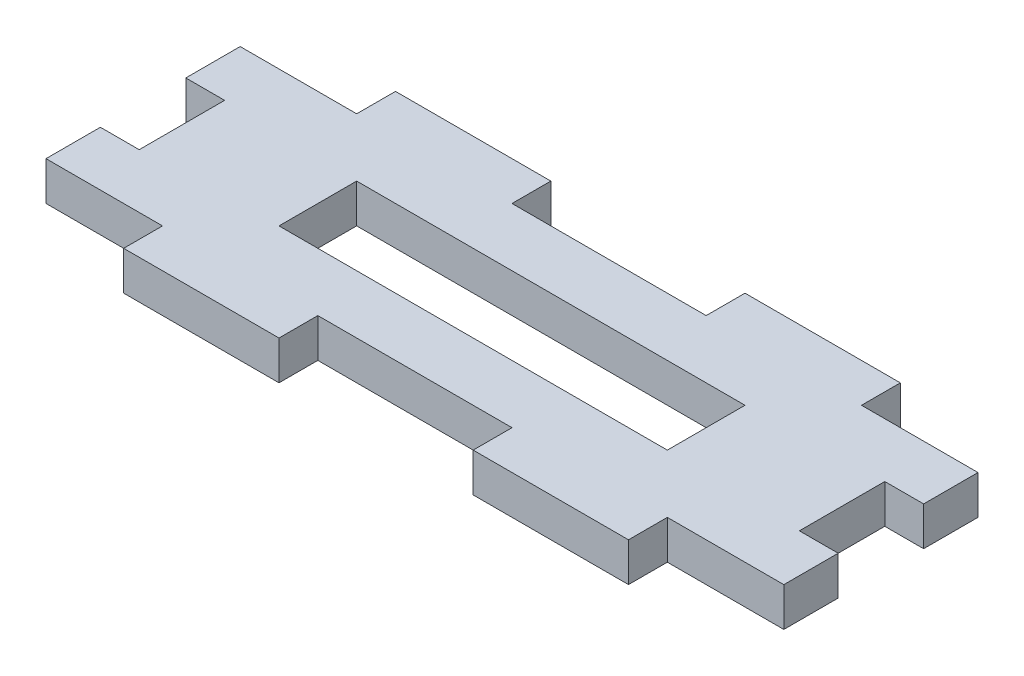
ISO-10303-21;
HEADER;
FILE_DESCRIPTION(('STEP AP214'),'2;1');
FILE_NAME('part.step','',(''),(''),'','','');
FILE_SCHEMA(('AUTOMOTIVE_DESIGN { 1 0 10303 214 1 1 1 1 }'));
ENDSEC;
DATA;
#1=APPLICATION_CONTEXT('core data for automotive mechanical design processes');
#2=APPLICATION_PROTOCOL_DEFINITION('international standard','automotive_design',2000,#1);
#3=PRODUCT_CONTEXT('',#1,'mechanical');
#4=PRODUCT('Part','Part','',(#3));
#5=PRODUCT_RELATED_PRODUCT_CATEGORY('part','',(#4));
#6=PRODUCT_DEFINITION_FORMATION('','',#4);
#7=PRODUCT_DEFINITION_CONTEXT('part definition',#1,'design');
#8=PRODUCT_DEFINITION('design','',#6,#7);
#9=PRODUCT_DEFINITION_SHAPE('','',#8);
#10=(LENGTH_UNIT() NAMED_UNIT(*) SI_UNIT(.MILLI.,.METRE.));
#11=(NAMED_UNIT(*) PLANE_ANGLE_UNIT() SI_UNIT($,.RADIAN.));
#12=(NAMED_UNIT(*) SI_UNIT($,.STERADIAN.) SOLID_ANGLE_UNIT());
#13=UNCERTAINTY_MEASURE_WITH_UNIT(LENGTH_MEASURE(1.E-05),#10,'distance_accuracy_value','');
#14=(GEOMETRIC_REPRESENTATION_CONTEXT(3) GLOBAL_UNCERTAINTY_ASSIGNED_CONTEXT((#13)) GLOBAL_UNIT_ASSIGNED_CONTEXT((#10,
#11,#12)) REPRESENTATION_CONTEXT('',''));
#15=CARTESIAN_POINT('',(0.,0.,0.));
#16=DIRECTION('',(0.,0.,1.));
#17=DIRECTION('',(1.,0.,0.));
#18=AXIS2_PLACEMENT_3D('',#15,#16,#17);
#19=CARTESIAN_POINT('',(0.,5.,0.));
#20=DIRECTION('',(0.,-1.,0.));
#21=DIRECTION('',(0.,0.,-1.));
#22=AXIS2_PLACEMENT_3D('',#19,#20,#21);
#23=PLANE('',#22);
#24=DIRECTION('',(0.,0.,-1.));
#25=VECTOR('',#24,1.);
#26=CARTESIAN_POINT('',(47.5,5.,-5.5));
#27=LINE('',#26,#25);
#28=CARTESIAN_POINT('',(47.5,5.,-5.5));
#29=VERTEX_POINT('',#28);
#30=CARTESIAN_POINT('',(47.5,5.,-12.5));
#31=VERTEX_POINT('',#30);
#32=EDGE_CURVE('E278',#29,#31,#27,.T.);
#33=ORIENTED_EDGE('',*,*,#32,.T.);
#34=DIRECTION('',(-1.,0.,0.));
#35=VECTOR('',#34,1.);
#36=CARTESIAN_POINT('',(32.5,5.,-12.5));
#37=LINE('',#36,#35);
#38=CARTESIAN_POINT('',(32.5,5.,-12.5));
#39=VERTEX_POINT('',#38);
#40=EDGE_CURVE('E281',#31,#39,#37,.T.);
#41=ORIENTED_EDGE('',*,*,#40,.T.);
#42=DIRECTION('',(0.,0.,-1.));
#43=VECTOR('',#42,1.);
#44=CARTESIAN_POINT('',(32.5,5.,-12.5));
#45=LINE('',#44,#43);
#46=CARTESIAN_POINT('',(32.5,5.,-17.5));
#47=VERTEX_POINT('',#46);
#48=EDGE_CURVE('E284',#39,#47,#45,.T.);
#49=ORIENTED_EDGE('',*,*,#48,.T.);
#50=DIRECTION('',(-1.,0.,0.));
#51=VECTOR('',#50,1.);
#52=CARTESIAN_POINT('',(12.5,5.,-17.5));
#53=LINE('',#52,#51);
#54=CARTESIAN_POINT('',(12.5,5.,-17.5));
#55=VERTEX_POINT('',#54);
#56=EDGE_CURVE('E286',#47,#55,#53,.T.);
#57=ORIENTED_EDGE('',*,*,#56,.T.);
#58=DIRECTION('',(0.,0.,1.));
#59=VECTOR('',#58,1.);
#60=CARTESIAN_POINT('',(12.5,5.,-12.5));
#61=LINE('',#60,#59);
#62=CARTESIAN_POINT('',(12.5,5.,-12.5));
#63=VERTEX_POINT('',#62);
#64=EDGE_CURVE('E288',#55,#63,#61,.T.);
#65=ORIENTED_EDGE('',*,*,#64,.T.);
#66=DIRECTION('',(-1.,0.,0.));
#67=VECTOR('',#66,1.);
#68=CARTESIAN_POINT('',(-12.5,5.,-12.5));
#69=LINE('',#68,#67);
#70=CARTESIAN_POINT('',(-12.5,5.,-12.5));
#71=VERTEX_POINT('',#70);
#72=EDGE_CURVE('E290',#63,#71,#69,.T.);
#73=ORIENTED_EDGE('',*,*,#72,.T.);
#74=DIRECTION('',(0.,0.,-1.));
#75=VECTOR('',#74,1.);
#76=CARTESIAN_POINT('',(-12.5,5.,-12.5));
#77=LINE('',#76,#75);
#78=CARTESIAN_POINT('',(-12.5,5.,-17.5));
#79=VERTEX_POINT('',#78);
#80=EDGE_CURVE('E292',#71,#79,#77,.T.);
#81=ORIENTED_EDGE('',*,*,#80,.T.);
#82=DIRECTION('',(-1.,0.,0.));
#83=VECTOR('',#82,1.);
#84=CARTESIAN_POINT('',(-32.5,5.,-17.5));
#85=LINE('',#84,#83);
#86=CARTESIAN_POINT('',(-32.5,5.,-17.5));
#87=VERTEX_POINT('',#86);
#88=EDGE_CURVE('E294',#79,#87,#85,.T.);
#89=ORIENTED_EDGE('',*,*,#88,.T.);
#90=DIRECTION('',(0.,0.,1.));
#91=VECTOR('',#90,1.);
#92=CARTESIAN_POINT('',(-32.5,5.,-12.5));
#93=LINE('',#92,#91);
#94=CARTESIAN_POINT('',(-32.5,5.,-12.5));
#95=VERTEX_POINT('',#94);
#96=EDGE_CURVE('E296',#87,#95,#93,.T.);
#97=ORIENTED_EDGE('',*,*,#96,.T.);
#98=DIRECTION('',(-1.,0.,0.));
#99=VECTOR('',#98,1.);
#100=CARTESIAN_POINT('',(-47.5,5.,-12.5));
#101=LINE('',#100,#99);
#102=CARTESIAN_POINT('',(-47.5,5.,-12.5));
#103=VERTEX_POINT('',#102);
#104=EDGE_CURVE('E298',#95,#103,#101,.T.);
#105=ORIENTED_EDGE('',*,*,#104,.T.);
#106=DIRECTION('',(0.,0.,1.));
#107=VECTOR('',#106,1.);
#108=CARTESIAN_POINT('',(-47.5,5.,-5.5));
#109=LINE('',#108,#107);
#110=CARTESIAN_POINT('',(-47.5,5.,-5.5));
#111=VERTEX_POINT('',#110);
#112=EDGE_CURVE('E300',#103,#111,#109,.T.);
#113=ORIENTED_EDGE('',*,*,#112,.T.);
#114=DIRECTION('',(1.,0.,0.));
#115=VECTOR('',#114,1.);
#116=CARTESIAN_POINT('',(-47.5,5.,-5.5));
#117=LINE('',#116,#115);
#118=CARTESIAN_POINT('',(-42.5,5.,-5.5));
#119=VERTEX_POINT('',#118);
#120=EDGE_CURVE('E302',#111,#119,#117,.T.);
#121=ORIENTED_EDGE('',*,*,#120,.T.);
#122=DIRECTION('',(0.,0.,1.));
#123=VECTOR('',#122,1.);
#124=CARTESIAN_POINT('',(-42.5,5.,-5.5));
#125=LINE('',#124,#123);
#126=CARTESIAN_POINT('',(-42.5,5.,5.50000000000001));
#127=VERTEX_POINT('',#126);
#128=EDGE_CURVE('E304',#119,#127,#125,.T.);
#129=ORIENTED_EDGE('',*,*,#128,.T.);
#130=DIRECTION('',(-1.,0.,0.));
#131=VECTOR('',#130,1.);
#132=CARTESIAN_POINT('',(-47.5,5.,5.5));
#133=LINE('',#132,#131);
#134=CARTESIAN_POINT('',(-47.5,5.,5.5));
#135=VERTEX_POINT('',#134);
#136=EDGE_CURVE('E306',#127,#135,#133,.T.);
#137=ORIENTED_EDGE('',*,*,#136,.T.);
#138=DIRECTION('',(0.,0.,1.));
#139=VECTOR('',#138,1.);
#140=CARTESIAN_POINT('',(-47.5,5.,12.5));
#141=LINE('',#140,#139);
#142=CARTESIAN_POINT('',(-47.5,5.,12.5));
#143=VERTEX_POINT('',#142);
#144=EDGE_CURVE('E308',#135,#143,#141,.T.);
#145=ORIENTED_EDGE('',*,*,#144,.T.);
#146=DIRECTION('',(1.,0.,0.));
#147=VECTOR('',#146,1.);
#148=CARTESIAN_POINT('',(-47.5,5.,12.5));
#149=LINE('',#148,#147);
#150=CARTESIAN_POINT('',(-32.5,5.,12.5));
#151=VERTEX_POINT('',#150);
#152=EDGE_CURVE('E310',#143,#151,#149,.T.);
#153=ORIENTED_EDGE('',*,*,#152,.T.);
#154=DIRECTION('',(0.,0.,1.));
#155=VECTOR('',#154,1.);
#156=CARTESIAN_POINT('',(-32.5,5.,12.5));
#157=LINE('',#156,#155);
#158=CARTESIAN_POINT('',(-32.5,5.,17.5));
#159=VERTEX_POINT('',#158);
#160=EDGE_CURVE('E312',#151,#159,#157,.T.);
#161=ORIENTED_EDGE('',*,*,#160,.T.);
#162=DIRECTION('',(1.,0.,0.));
#163=VECTOR('',#162,1.);
#164=CARTESIAN_POINT('',(-32.5,5.,17.5));
#165=LINE('',#164,#163);
#166=CARTESIAN_POINT('',(-12.5,5.,17.5));
#167=VERTEX_POINT('',#166);
#168=EDGE_CURVE('E314',#159,#167,#165,.T.);
#169=ORIENTED_EDGE('',*,*,#168,.T.);
#170=DIRECTION('',(0.,0.,-1.));
#171=VECTOR('',#170,1.);
#172=CARTESIAN_POINT('',(-12.5,5.,12.5));
#173=LINE('',#172,#171);
#174=CARTESIAN_POINT('',(-12.5,5.,12.5));
#175=VERTEX_POINT('',#174);
#176=EDGE_CURVE('E316',#167,#175,#173,.T.);
#177=ORIENTED_EDGE('',*,*,#176,.T.);
#178=DIRECTION('',(1.,0.,0.));
#179=VECTOR('',#178,1.);
#180=CARTESIAN_POINT('',(-12.5,5.,12.5));
#181=LINE('',#180,#179);
#182=CARTESIAN_POINT('',(12.5,5.,12.5));
#183=VERTEX_POINT('',#182);
#184=EDGE_CURVE('E318',#175,#183,#181,.T.);
#185=ORIENTED_EDGE('',*,*,#184,.T.);
#186=DIRECTION('',(0.,0.,1.));
#187=VECTOR('',#186,1.);
#188=CARTESIAN_POINT('',(12.5,5.,12.5));
#189=LINE('',#188,#187);
#190=CARTESIAN_POINT('',(12.5,5.,17.5));
#191=VERTEX_POINT('',#190);
#192=EDGE_CURVE('E320',#183,#191,#189,.T.);
#193=ORIENTED_EDGE('',*,*,#192,.T.);
#194=DIRECTION('',(1.,0.,0.));
#195=VECTOR('',#194,1.);
#196=CARTESIAN_POINT('',(12.5,5.,17.5));
#197=LINE('',#196,#195);
#198=CARTESIAN_POINT('',(32.5,5.,17.5));
#199=VERTEX_POINT('',#198);
#200=EDGE_CURVE('E322',#191,#199,#197,.T.);
#201=ORIENTED_EDGE('',*,*,#200,.T.);
#202=DIRECTION('',(0.,0.,-1.));
#203=VECTOR('',#202,1.);
#204=CARTESIAN_POINT('',(32.5,5.,12.5));
#205=LINE('',#204,#203);
#206=CARTESIAN_POINT('',(32.5,5.,12.5));
#207=VERTEX_POINT('',#206);
#208=EDGE_CURVE('E324',#199,#207,#205,.T.);
#209=ORIENTED_EDGE('',*,*,#208,.T.);
#210=DIRECTION('',(1.,0.,0.));
#211=VECTOR('',#210,1.);
#212=CARTESIAN_POINT('',(32.5,5.,12.5));
#213=LINE('',#212,#211);
#214=CARTESIAN_POINT('',(47.5,5.,12.5));
#215=VERTEX_POINT('',#214);
#216=EDGE_CURVE('E326',#207,#215,#213,.T.);
#217=ORIENTED_EDGE('',*,*,#216,.T.);
#218=DIRECTION('',(0.,0.,-1.));
#219=VECTOR('',#218,1.);
#220=CARTESIAN_POINT('',(47.5,5.,12.5));
#221=LINE('',#220,#219);
#222=CARTESIAN_POINT('',(47.5,5.,5.5));
#223=VERTEX_POINT('',#222);
#224=EDGE_CURVE('E328',#215,#223,#221,.T.);
#225=ORIENTED_EDGE('',*,*,#224,.T.);
#226=DIRECTION('',(-1.,0.,0.));
#227=VECTOR('',#226,1.);
#228=CARTESIAN_POINT('',(47.5,5.,5.5));
#229=LINE('',#228,#227);
#230=CARTESIAN_POINT('',(42.5,5.,5.50000000000001));
#231=VERTEX_POINT('',#230);
#232=EDGE_CURVE('E330',#223,#231,#229,.T.);
#233=ORIENTED_EDGE('',*,*,#232,.T.);
#234=DIRECTION('',(0.,0.,-1.));
#235=VECTOR('',#234,1.);
#236=CARTESIAN_POINT('',(42.5,5.,-5.5));
#237=LINE('',#236,#235);
#238=CARTESIAN_POINT('',(42.5,5.,-5.5));
#239=VERTEX_POINT('',#238);
#240=EDGE_CURVE('E332',#231,#239,#237,.T.);
#241=ORIENTED_EDGE('',*,*,#240,.T.);
#242=DIRECTION('',(1.,0.,0.));
#243=VECTOR('',#242,1.);
#244=CARTESIAN_POINT('',(47.5,5.,-5.5));
#245=LINE('',#244,#243);
#246=EDGE_CURVE('E334',#239,#29,#245,.T.);
#247=ORIENTED_EDGE('',*,*,#246,.T.);
#248=EDGE_LOOP('',(#33,#41,#49,#57,#65,#73,#81,#89,#97,#105,#113,#121,#129,#137,#145,#153,#161,
#169,#177,#185,#193,#201,#209,#217,#225,#233,#241,#247));
#249=FACE_BOUND('',#248,.T.);
#250=DIRECTION('',(0.,0.,-1.));
#251=VECTOR('',#250,1.);
#252=CARTESIAN_POINT('',(25.,5.,5.));
#253=LINE('',#252,#251);
#254=CARTESIAN_POINT('',(25.,5.,5.));
#255=VERTEX_POINT('',#254);
#256=CARTESIAN_POINT('',(25.,5.,-5.));
#257=VERTEX_POINT('',#256);
#258=EDGE_CURVE('E242',#255,#257,#253,.T.);
#259=ORIENTED_EDGE('',*,*,#258,.F.);
#260=DIRECTION('',(1.,0.,0.));
#261=VECTOR('',#260,1.);
#262=CARTESIAN_POINT('',(-25.,5.,5.));
#263=LINE('',#262,#261);
#264=CARTESIAN_POINT('',(-25.,5.,5.));
#265=VERTEX_POINT('',#264);
#266=EDGE_CURVE('E264',#265,#255,#263,.T.);
#267=ORIENTED_EDGE('',*,*,#266,.F.);
#268=DIRECTION('',(0.,0.,1.));
#269=VECTOR('',#268,1.);
#270=CARTESIAN_POINT('',(-25.,5.,5.));
#271=LINE('',#270,#269);
#272=CARTESIAN_POINT('',(-25.,5.,-5.));
#273=VERTEX_POINT('',#272);
#274=EDGE_CURVE('E262',#273,#265,#271,.T.);
#275=ORIENTED_EDGE('',*,*,#274,.F.);
#276=DIRECTION('',(-1.,0.,0.));
#277=VECTOR('',#276,1.);
#278=CARTESIAN_POINT('',(-25.,5.,-5.));
#279=LINE('',#278,#277);
#280=EDGE_CURVE('E250',#257,#273,#279,.T.);
#281=ORIENTED_EDGE('',*,*,#280,.F.);
#282=EDGE_LOOP('',(#259,#267,#275,#281));
#283=FACE_BOUND('',#282,.T.);
#284=ADVANCED_FACE('F33',(#249,#283),#23,.F.);
#285=CARTESIAN_POINT('',(0.,0.,0.));
#286=DIRECTION('',(0.,-1.,0.));
#287=DIRECTION('',(0.,0.,-1.));
#288=AXIS2_PLACEMENT_3D('',#285,#286,#287);
#289=PLANE('',#288);
#290=DIRECTION('',(0.,0.,-1.));
#291=VECTOR('',#290,1.);
#292=CARTESIAN_POINT('',(47.5,0.,-5.5));
#293=LINE('',#292,#291);
#294=CARTESIAN_POINT('',(47.5,0.,-5.5));
#295=VERTEX_POINT('',#294);
#296=CARTESIAN_POINT('',(47.5,0.,-12.5));
#297=VERTEX_POINT('',#296);
#298=EDGE_CURVE('E258',#295,#297,#293,.T.);
#299=ORIENTED_EDGE('',*,*,#298,.F.);
#300=DIRECTION('',(1.,0.,0.));
#301=VECTOR('',#300,1.);
#302=CARTESIAN_POINT('',(47.5,0.,-5.5));
#303=LINE('',#302,#301);
#304=CARTESIAN_POINT('',(42.5,0.,-5.5));
#305=VERTEX_POINT('',#304);
#306=EDGE_CURVE('E282',#305,#295,#303,.T.);
#307=ORIENTED_EDGE('',*,*,#306,.F.);
#308=DIRECTION('',(0.,0.,-1.));
#309=VECTOR('',#308,1.);
#310=CARTESIAN_POINT('',(42.5,0.,-5.5));
#311=LINE('',#310,#309);
#312=CARTESIAN_POINT('',(42.5,0.,5.50000000000001));
#313=VERTEX_POINT('',#312);
#314=EDGE_CURVE('E389',#313,#305,#311,.T.);
#315=ORIENTED_EDGE('',*,*,#314,.F.);
#316=DIRECTION('',(-1.,0.,0.));
#317=VECTOR('',#316,1.);
#318=CARTESIAN_POINT('',(47.5,0.,5.5));
#319=LINE('',#318,#317);
#320=CARTESIAN_POINT('',(47.5,0.,5.5));
#321=VERTEX_POINT('',#320);
#322=EDGE_CURVE('E387',#321,#313,#319,.T.);
#323=ORIENTED_EDGE('',*,*,#322,.F.);
#324=DIRECTION('',(0.,0.,-1.));
#325=VECTOR('',#324,1.);
#326=CARTESIAN_POINT('',(47.5,0.,12.5));
#327=LINE('',#326,#325);
#328=CARTESIAN_POINT('',(47.5,0.,12.5));
#329=VERTEX_POINT('',#328);
#330=EDGE_CURVE('E385',#329,#321,#327,.T.);
#331=ORIENTED_EDGE('',*,*,#330,.F.);
#332=DIRECTION('',(1.,0.,0.));
#333=VECTOR('',#332,1.);
#334=CARTESIAN_POINT('',(32.5,0.,12.5));
#335=LINE('',#334,#333);
#336=CARTESIAN_POINT('',(32.5,0.,12.5));
#337=VERTEX_POINT('',#336);
#338=EDGE_CURVE('E383',#337,#329,#335,.T.);
#339=ORIENTED_EDGE('',*,*,#338,.F.);
#340=DIRECTION('',(0.,0.,-1.));
#341=VECTOR('',#340,1.);
#342=CARTESIAN_POINT('',(32.5,0.,12.5));
#343=LINE('',#342,#341);
#344=CARTESIAN_POINT('',(32.5,0.,17.5));
#345=VERTEX_POINT('',#344);
#346=EDGE_CURVE('E381',#345,#337,#343,.T.);
#347=ORIENTED_EDGE('',*,*,#346,.F.);
#348=DIRECTION('',(1.,0.,0.));
#349=VECTOR('',#348,1.);
#350=CARTESIAN_POINT('',(12.5,0.,17.5));
#351=LINE('',#350,#349);
#352=CARTESIAN_POINT('',(12.5,0.,17.5));
#353=VERTEX_POINT('',#352);
#354=EDGE_CURVE('E379',#353,#345,#351,.T.);
#355=ORIENTED_EDGE('',*,*,#354,.F.);
#356=DIRECTION('',(0.,0.,1.));
#357=VECTOR('',#356,1.);
#358=CARTESIAN_POINT('',(12.5,0.,12.5));
#359=LINE('',#358,#357);
#360=CARTESIAN_POINT('',(12.5,0.,12.5));
#361=VERTEX_POINT('',#360);
#362=EDGE_CURVE('E377',#361,#353,#359,.T.);
#363=ORIENTED_EDGE('',*,*,#362,.F.);
#364=DIRECTION('',(1.,0.,0.));
#365=VECTOR('',#364,1.);
#366=CARTESIAN_POINT('',(-12.5,0.,12.5));
#367=LINE('',#366,#365);
#368=CARTESIAN_POINT('',(-12.5,0.,12.5));
#369=VERTEX_POINT('',#368);
#370=EDGE_CURVE('E375',#369,#361,#367,.T.);
#371=ORIENTED_EDGE('',*,*,#370,.F.);
#372=DIRECTION('',(0.,0.,-1.));
#373=VECTOR('',#372,1.);
#374=CARTESIAN_POINT('',(-12.5,0.,12.5));
#375=LINE('',#374,#373);
#376=CARTESIAN_POINT('',(-12.5,0.,17.5));
#377=VERTEX_POINT('',#376);
#378=EDGE_CURVE('E373',#377,#369,#375,.T.);
#379=ORIENTED_EDGE('',*,*,#378,.F.);
#380=DIRECTION('',(1.,0.,0.));
#381=VECTOR('',#380,1.);
#382=CARTESIAN_POINT('',(-32.5,0.,17.5));
#383=LINE('',#382,#381);
#384=CARTESIAN_POINT('',(-32.5,0.,17.5));
#385=VERTEX_POINT('',#384);
#386=EDGE_CURVE('E371',#385,#377,#383,.T.);
#387=ORIENTED_EDGE('',*,*,#386,.F.);
#388=DIRECTION('',(0.,0.,1.));
#389=VECTOR('',#388,1.);
#390=CARTESIAN_POINT('',(-32.5,0.,12.5));
#391=LINE('',#390,#389);
#392=CARTESIAN_POINT('',(-32.5,0.,12.5));
#393=VERTEX_POINT('',#392);
#394=EDGE_CURVE('E369',#393,#385,#391,.T.);
#395=ORIENTED_EDGE('',*,*,#394,.F.);
#396=DIRECTION('',(1.,0.,0.));
#397=VECTOR('',#396,1.);
#398=CARTESIAN_POINT('',(-47.5,0.,12.5));
#399=LINE('',#398,#397);
#400=CARTESIAN_POINT('',(-47.5,0.,12.5));
#401=VERTEX_POINT('',#400);
#402=EDGE_CURVE('E367',#401,#393,#399,.T.);
#403=ORIENTED_EDGE('',*,*,#402,.F.);
#404=DIRECTION('',(0.,0.,1.));
#405=VECTOR('',#404,1.);
#406=CARTESIAN_POINT('',(-47.5,0.,12.5));
#407=LINE('',#406,#405);
#408=CARTESIAN_POINT('',(-47.5,0.,5.5));
#409=VERTEX_POINT('',#408);
#410=EDGE_CURVE('E365',#409,#401,#407,.T.);
#411=ORIENTED_EDGE('',*,*,#410,.F.);
#412=DIRECTION('',(-1.,0.,0.));
#413=VECTOR('',#412,1.);
#414=CARTESIAN_POINT('',(-47.5,0.,5.5));
#415=LINE('',#414,#413);
#416=CARTESIAN_POINT('',(-42.5,0.,5.50000000000001));
#417=VERTEX_POINT('',#416);
#418=EDGE_CURVE('E363',#417,#409,#415,.T.);
#419=ORIENTED_EDGE('',*,*,#418,.F.);
#420=DIRECTION('',(0.,0.,1.));
#421=VECTOR('',#420,1.);
#422=CARTESIAN_POINT('',(-42.5,0.,-5.5));
#423=LINE('',#422,#421);
#424=CARTESIAN_POINT('',(-42.5,0.,-5.5));
#425=VERTEX_POINT('',#424);
#426=EDGE_CURVE('E361',#425,#417,#423,.T.);
#427=ORIENTED_EDGE('',*,*,#426,.F.);
#428=DIRECTION('',(1.,0.,0.));
#429=VECTOR('',#428,1.);
#430=CARTESIAN_POINT('',(-47.5,0.,-5.5));
#431=LINE('',#430,#429);
#432=CARTESIAN_POINT('',(-47.5,0.,-5.5));
#433=VERTEX_POINT('',#432);
#434=EDGE_CURVE('E359',#433,#425,#431,.T.);
#435=ORIENTED_EDGE('',*,*,#434,.F.);
#436=DIRECTION('',(0.,0.,1.));
#437=VECTOR('',#436,1.);
#438=CARTESIAN_POINT('',(-47.5,0.,-5.5));
#439=LINE('',#438,#437);
#440=CARTESIAN_POINT('',(-47.5,0.,-12.5));
#441=VERTEX_POINT('',#440);
#442=EDGE_CURVE('E357',#441,#433,#439,.T.);
#443=ORIENTED_EDGE('',*,*,#442,.F.);
#444=DIRECTION('',(-1.,0.,0.));
#445=VECTOR('',#444,1.);
#446=CARTESIAN_POINT('',(-47.5,0.,-12.5));
#447=LINE('',#446,#445);
#448=CARTESIAN_POINT('',(-32.5,0.,-12.5));
#449=VERTEX_POINT('',#448);
#450=EDGE_CURVE('E355',#449,#441,#447,.T.);
#451=ORIENTED_EDGE('',*,*,#450,.F.);
#452=DIRECTION('',(0.,0.,1.));
#453=VECTOR('',#452,1.);
#454=CARTESIAN_POINT('',(-32.5,0.,-12.5));
#455=LINE('',#454,#453);
#456=CARTESIAN_POINT('',(-32.5,0.,-17.5));
#457=VERTEX_POINT('',#456);
#458=EDGE_CURVE('E353',#457,#449,#455,.T.);
#459=ORIENTED_EDGE('',*,*,#458,.F.);
#460=DIRECTION('',(-1.,0.,0.));
#461=VECTOR('',#460,1.);
#462=CARTESIAN_POINT('',(-32.5,0.,-17.5));
#463=LINE('',#462,#461);
#464=CARTESIAN_POINT('',(-12.5,0.,-17.5));
#465=VERTEX_POINT('',#464);
#466=EDGE_CURVE('E351',#465,#457,#463,.T.);
#467=ORIENTED_EDGE('',*,*,#466,.F.);
#468=DIRECTION('',(0.,0.,-1.));
#469=VECTOR('',#468,1.);
#470=CARTESIAN_POINT('',(-12.5,0.,-12.5));
#471=LINE('',#470,#469);
#472=CARTESIAN_POINT('',(-12.5,0.,-12.5));
#473=VERTEX_POINT('',#472);
#474=EDGE_CURVE('E349',#473,#465,#471,.T.);
#475=ORIENTED_EDGE('',*,*,#474,.F.);
#476=DIRECTION('',(-1.,0.,0.));
#477=VECTOR('',#476,1.);
#478=CARTESIAN_POINT('',(-12.5,0.,-12.5));
#479=LINE('',#478,#477);
#480=CARTESIAN_POINT('',(12.5,0.,-12.5));
#481=VERTEX_POINT('',#480);
#482=EDGE_CURVE('E347',#481,#473,#479,.T.);
#483=ORIENTED_EDGE('',*,*,#482,.F.);
#484=DIRECTION('',(0.,0.,1.));
#485=VECTOR('',#484,1.);
#486=CARTESIAN_POINT('',(12.5,0.,-12.5));
#487=LINE('',#486,#485);
#488=CARTESIAN_POINT('',(12.5,0.,-17.5));
#489=VERTEX_POINT('',#488);
#490=EDGE_CURVE('E345',#489,#481,#487,.T.);
#491=ORIENTED_EDGE('',*,*,#490,.F.);
#492=DIRECTION('',(-1.,0.,0.));
#493=VECTOR('',#492,1.);
#494=CARTESIAN_POINT('',(12.5,0.,-17.5));
#495=LINE('',#494,#493);
#496=CARTESIAN_POINT('',(32.5,0.,-17.5));
#497=VERTEX_POINT('',#496);
#498=EDGE_CURVE('E343',#497,#489,#495,.T.);
#499=ORIENTED_EDGE('',*,*,#498,.F.);
#500=DIRECTION('',(0.,0.,-1.));
#501=VECTOR('',#500,1.);
#502=CARTESIAN_POINT('',(32.5,0.,-12.5));
#503=LINE('',#502,#501);
#504=CARTESIAN_POINT('',(32.5,0.,-12.5));
#505=VERTEX_POINT('',#504);
#506=EDGE_CURVE('E341',#505,#497,#503,.T.);
#507=ORIENTED_EDGE('',*,*,#506,.F.);
#508=DIRECTION('',(-1.,0.,0.));
#509=VECTOR('',#508,1.);
#510=CARTESIAN_POINT('',(32.5,0.,-12.5));
#511=LINE('',#510,#509);
#512=EDGE_CURVE('E339',#297,#505,#511,.T.);
#513=ORIENTED_EDGE('',*,*,#512,.F.);
#514=EDGE_LOOP('',(#299,#307,#315,#323,#331,#339,#347,#355,#363,#371,#379,#387,#395,#403,#411,
#419,#427,#435,#443,#451,#459,#467,#475,#483,#491,#499,#507,#513));
#515=FACE_BOUND('',#514,.T.);
#516=DIRECTION('',(1.,0.,0.));
#517=VECTOR('',#516,1.);
#518=CARTESIAN_POINT('',(-25.,0.,5.));
#519=LINE('',#518,#517);
#520=CARTESIAN_POINT('',(-25.,0.,5.));
#521=VERTEX_POINT('',#520);
#522=CARTESIAN_POINT('',(25.,0.,5.));
#523=VERTEX_POINT('',#522);
#524=EDGE_CURVE('E251',#521,#523,#519,.T.);
#525=ORIENTED_EDGE('',*,*,#524,.T.);
#526=DIRECTION('',(0.,0.,-1.));
#527=VECTOR('',#526,1.);
#528=CARTESIAN_POINT('',(25.,0.,5.));
#529=LINE('',#528,#527);
#530=CARTESIAN_POINT('',(25.,0.,-5.));
#531=VERTEX_POINT('',#530);
#532=EDGE_CURVE('E56',#523,#531,#529,.T.);
#533=ORIENTED_EDGE('',*,*,#532,.T.);
#534=DIRECTION('',(-1.,0.,0.));
#535=VECTOR('',#534,1.);
#536=CARTESIAN_POINT('',(-25.,0.,-5.));
#537=LINE('',#536,#535);
#538=CARTESIAN_POINT('',(-25.,0.,-5.));
#539=VERTEX_POINT('',#538);
#540=EDGE_CURVE('E257',#531,#539,#537,.T.);
#541=ORIENTED_EDGE('',*,*,#540,.T.);
#542=DIRECTION('',(0.,0.,1.));
#543=VECTOR('',#542,1.);
#544=CARTESIAN_POINT('',(-25.,0.,5.));
#545=LINE('',#544,#543);
#546=EDGE_CURVE('E270',#539,#521,#545,.T.);
#547=ORIENTED_EDGE('',*,*,#546,.T.);
#548=EDGE_LOOP('',(#525,#533,#541,#547));
#549=FACE_BOUND('',#548,.T.);
#550=ADVANCED_FACE('F479',(#515,#549),#289,.T.);
#551=CARTESIAN_POINT('',(47.5,5.,-5.5));
#552=DIRECTION('',(-1.,0.,0.));
#553=DIRECTION('',(0.,0.,1.));
#554=AXIS2_PLACEMENT_3D('',#551,#552,#553);
#555=PLANE('',#554);
#556=ORIENTED_EDGE('',*,*,#298,.T.);
#557=DIRECTION('',(0.,-1.,0.));
#558=VECTOR('',#557,1.);
#559=CARTESIAN_POINT('',(47.5,5.,-12.5));
#560=LINE('',#559,#558);
#561=EDGE_CURVE('E11',#31,#297,#560,.T.);
#562=ORIENTED_EDGE('',*,*,#561,.F.);
#563=ORIENTED_EDGE('',*,*,#32,.F.);
#564=DIRECTION('',(0.,-1.,0.));
#565=VECTOR('',#564,1.);
#566=CARTESIAN_POINT('',(47.5,5.,-5.5));
#567=LINE('',#566,#565);
#568=EDGE_CURVE('E336',#29,#295,#567,.T.);
#569=ORIENTED_EDGE('',*,*,#568,.T.);
#570=EDGE_LOOP('',(#556,#562,#563,#569));
#571=FACE_BOUND('',#570,.T.);
#572=ADVANCED_FACE('F35',(#571),#555,.F.);
#573=CARTESIAN_POINT('',(32.5,5.,-12.5));
#574=DIRECTION('',(0.,0.,1.));
#575=DIRECTION('',(1.,0.,0.));
#576=AXIS2_PLACEMENT_3D('',#573,#574,#575);
#577=PLANE('',#576);
#578=ORIENTED_EDGE('',*,*,#512,.T.);
#579=DIRECTION('',(0.,-1.,0.));
#580=VECTOR('',#579,1.);
#581=CARTESIAN_POINT('',(32.5,5.,-12.5));
#582=LINE('',#581,#580);
#583=EDGE_CURVE('E41',#39,#505,#582,.T.);
#584=ORIENTED_EDGE('',*,*,#583,.F.);
#585=ORIENTED_EDGE('',*,*,#40,.F.);
#586=ORIENTED_EDGE('',*,*,#561,.T.);
#587=EDGE_LOOP('',(#578,#584,#585,#586));
#588=FACE_BOUND('',#587,.T.);
#589=ADVANCED_FACE('F496',(#588),#577,.F.);
#590=CARTESIAN_POINT('',(32.5,5.,-12.5));
#591=DIRECTION('',(-1.,0.,0.));
#592=DIRECTION('',(0.,0.,1.));
#593=AXIS2_PLACEMENT_3D('',#590,#591,#592);
#594=PLANE('',#593);
#595=ORIENTED_EDGE('',*,*,#506,.T.);
#596=DIRECTION('',(0.,-1.,0.));
#597=VECTOR('',#596,1.);
#598=CARTESIAN_POINT('',(32.5,5.,-17.5));
#599=LINE('',#598,#597);
#600=EDGE_CURVE('E466',#47,#497,#599,.T.);
#601=ORIENTED_EDGE('',*,*,#600,.F.);
#602=ORIENTED_EDGE('',*,*,#48,.F.);
#603=ORIENTED_EDGE('',*,*,#583,.T.);
#604=EDGE_LOOP('',(#595,#601,#602,#603));
#605=FACE_BOUND('',#604,.T.);
#606=ADVANCED_FACE('F473',(#605),#594,.F.);
#607=CARTESIAN_POINT('',(12.5,5.,-17.5));
#608=DIRECTION('',(0.,0.,1.));
#609=DIRECTION('',(1.,0.,0.));
#610=AXIS2_PLACEMENT_3D('',#607,#608,#609);
#611=PLANE('',#610);
#612=ORIENTED_EDGE('',*,*,#498,.T.);
#613=DIRECTION('',(0.,-1.,0.));
#614=VECTOR('',#613,1.);
#615=CARTESIAN_POINT('',(12.5,5.,-17.5));
#616=LINE('',#615,#614);
#617=EDGE_CURVE('E463',#55,#489,#616,.T.);
#618=ORIENTED_EDGE('',*,*,#617,.F.);
#619=ORIENTED_EDGE('',*,*,#56,.F.);
#620=ORIENTED_EDGE('',*,*,#600,.T.);
#621=EDGE_LOOP('',(#612,#618,#619,#620));
#622=FACE_BOUND('',#621,.T.);
#623=ADVANCED_FACE('F485',(#622),#611,.F.);
#624=CARTESIAN_POINT('',(12.5,5.,-12.5));
#625=DIRECTION('',(1.,0.,0.));
#626=DIRECTION('',(0.,0.,-1.));
#627=AXIS2_PLACEMENT_3D('',#624,#625,#626);
#628=PLANE('',#627);
#629=ORIENTED_EDGE('',*,*,#490,.T.);
#630=DIRECTION('',(0.,-1.,0.));
#631=VECTOR('',#630,1.);
#632=CARTESIAN_POINT('',(12.5,5.,-12.5));
#633=LINE('',#632,#631);
#634=EDGE_CURVE('E460',#63,#481,#633,.T.);
#635=ORIENTED_EDGE('',*,*,#634,.F.);
#636=ORIENTED_EDGE('',*,*,#64,.F.);
#637=ORIENTED_EDGE('',*,*,#617,.T.);
#638=EDGE_LOOP('',(#629,#635,#636,#637));
#639=FACE_BOUND('',#638,.T.);
#640=ADVANCED_FACE('F489',(#639),#628,.F.);
#641=CARTESIAN_POINT('',(-12.5,5.,-12.5));
#642=DIRECTION('',(0.,0.,1.));
#643=DIRECTION('',(1.,0.,0.));
#644=AXIS2_PLACEMENT_3D('',#641,#642,#643);
#645=PLANE('',#644);
#646=ORIENTED_EDGE('',*,*,#482,.T.);
#647=DIRECTION('',(0.,-1.,0.));
#648=VECTOR('',#647,1.);
#649=CARTESIAN_POINT('',(-12.5,5.,-12.5));
#650=LINE('',#649,#648);
#651=EDGE_CURVE('E457',#71,#473,#650,.T.);
#652=ORIENTED_EDGE('',*,*,#651,.F.);
#653=ORIENTED_EDGE('',*,*,#72,.F.);
#654=ORIENTED_EDGE('',*,*,#634,.T.);
#655=EDGE_LOOP('',(#646,#652,#653,#654));
#656=FACE_BOUND('',#655,.T.);
#657=ADVANCED_FACE('F609',(#656),#645,.F.);
#658=CARTESIAN_POINT('',(-12.5,5.,-12.5));
#659=DIRECTION('',(-1.,0.,0.));
#660=DIRECTION('',(0.,0.,1.));
#661=AXIS2_PLACEMENT_3D('',#658,#659,#660);
#662=PLANE('',#661);
#663=ORIENTED_EDGE('',*,*,#474,.T.);
#664=DIRECTION('',(0.,-1.,0.));
#665=VECTOR('',#664,1.);
#666=CARTESIAN_POINT('',(-12.5,5.,-17.5));
#667=LINE('',#666,#665);
#668=EDGE_CURVE('E454',#79,#465,#667,.T.);
#669=ORIENTED_EDGE('',*,*,#668,.F.);
#670=ORIENTED_EDGE('',*,*,#80,.F.);
#671=ORIENTED_EDGE('',*,*,#651,.T.);
#672=EDGE_LOOP('',(#663,#669,#670,#671));
#673=FACE_BOUND('',#672,.T.);
#674=ADVANCED_FACE('F606',(#673),#662,.F.);
#675=CARTESIAN_POINT('',(-32.5,5.,-17.5));
#676=DIRECTION('',(0.,0.,1.));
#677=DIRECTION('',(1.,0.,0.));
#678=AXIS2_PLACEMENT_3D('',#675,#676,#677);
#679=PLANE('',#678);
#680=ORIENTED_EDGE('',*,*,#466,.T.);
#681=DIRECTION('',(0.,-1.,0.));
#682=VECTOR('',#681,1.);
#683=CARTESIAN_POINT('',(-32.5,5.,-17.5));
#684=LINE('',#683,#682);
#685=EDGE_CURVE('E451',#87,#457,#684,.T.);
#686=ORIENTED_EDGE('',*,*,#685,.F.);
#687=ORIENTED_EDGE('',*,*,#88,.F.);
#688=ORIENTED_EDGE('',*,*,#668,.T.);
#689=EDGE_LOOP('',(#680,#686,#687,#688));
#690=FACE_BOUND('',#689,.T.);
#691=ADVANCED_FACE('F602',(#690),#679,.F.);
#692=CARTESIAN_POINT('',(-32.5,5.,-12.5));
#693=DIRECTION('',(1.,0.,0.));
#694=DIRECTION('',(0.,0.,-1.));
#695=AXIS2_PLACEMENT_3D('',#692,#693,#694);
#696=PLANE('',#695);
#697=ORIENTED_EDGE('',*,*,#458,.T.);
#698=DIRECTION('',(0.,-1.,0.));
#699=VECTOR('',#698,1.);
#700=CARTESIAN_POINT('',(-32.5,5.,-12.5));
#701=LINE('',#700,#699);
#702=EDGE_CURVE('E448',#95,#449,#701,.T.);
#703=ORIENTED_EDGE('',*,*,#702,.F.);
#704=ORIENTED_EDGE('',*,*,#96,.F.);
#705=ORIENTED_EDGE('',*,*,#685,.T.);
#706=EDGE_LOOP('',(#697,#703,#704,#705));
#707=FACE_BOUND('',#706,.T.);
#708=ADVANCED_FACE('F598',(#707),#696,.F.);
#709=CARTESIAN_POINT('',(-47.5,5.,-12.5));
#710=DIRECTION('',(0.,0.,1.));
#711=DIRECTION('',(1.,0.,0.));
#712=AXIS2_PLACEMENT_3D('',#709,#710,#711);
#713=PLANE('',#712);
#714=ORIENTED_EDGE('',*,*,#450,.T.);
#715=DIRECTION('',(0.,-1.,0.));
#716=VECTOR('',#715,1.);
#717=CARTESIAN_POINT('',(-47.5,5.,-12.5));
#718=LINE('',#717,#716);
#719=EDGE_CURVE('E445',#103,#441,#718,.T.);
#720=ORIENTED_EDGE('',*,*,#719,.F.);
#721=ORIENTED_EDGE('',*,*,#104,.F.);
#722=ORIENTED_EDGE('',*,*,#702,.T.);
#723=EDGE_LOOP('',(#714,#720,#721,#722));
#724=FACE_BOUND('',#723,.T.);
#725=ADVANCED_FACE('F593',(#724),#713,.F.);
#726=CARTESIAN_POINT('',(-47.5,5.,-5.5));
#727=DIRECTION('',(1.,0.,0.));
#728=DIRECTION('',(0.,0.,-1.));
#729=AXIS2_PLACEMENT_3D('',#726,#727,#728);
#730=PLANE('',#729);
#731=ORIENTED_EDGE('',*,*,#442,.T.);
#732=DIRECTION('',(0.,-1.,0.));
#733=VECTOR('',#732,1.);
#734=CARTESIAN_POINT('',(-47.5,5.,-5.5));
#735=LINE('',#734,#733);
#736=EDGE_CURVE('E442',#111,#433,#735,.T.);
#737=ORIENTED_EDGE('',*,*,#736,.F.);
#738=ORIENTED_EDGE('',*,*,#112,.F.);
#739=ORIENTED_EDGE('',*,*,#719,.T.);
#740=EDGE_LOOP('',(#731,#737,#738,#739));
#741=FACE_BOUND('',#740,.T.);
#742=ADVANCED_FACE('F587',(#741),#730,.F.);
#743=CARTESIAN_POINT('',(-47.5,5.,-5.5));
#744=DIRECTION('',(0.,0.,-1.));
#745=DIRECTION('',(-1.,0.,0.));
#746=AXIS2_PLACEMENT_3D('',#743,#744,#745);
#747=PLANE('',#746);
#748=ORIENTED_EDGE('',*,*,#434,.T.);
#749=DIRECTION('',(0.,-1.,0.));
#750=VECTOR('',#749,1.);
#751=CARTESIAN_POINT('',(-42.5,5.,-5.5));
#752=LINE('',#751,#750);
#753=EDGE_CURVE('E439',#119,#425,#752,.T.);
#754=ORIENTED_EDGE('',*,*,#753,.F.);
#755=ORIENTED_EDGE('',*,*,#120,.F.);
#756=ORIENTED_EDGE('',*,*,#736,.T.);
#757=EDGE_LOOP('',(#748,#754,#755,#756));
#758=FACE_BOUND('',#757,.T.);
#759=ADVANCED_FACE('F583',(#758),#747,.F.);
#760=CARTESIAN_POINT('',(-42.5,5.,-5.5));
#761=DIRECTION('',(1.,0.,0.));
#762=DIRECTION('',(0.,0.,-1.));
#763=AXIS2_PLACEMENT_3D('',#760,#761,#762);
#764=PLANE('',#763);
#765=ORIENTED_EDGE('',*,*,#426,.T.);
#766=DIRECTION('',(0.,-1.,0.));
#767=VECTOR('',#766,1.);
#768=CARTESIAN_POINT('',(-42.5,5.,5.50000000000001));
#769=LINE('',#768,#767);
#770=EDGE_CURVE('E436',#127,#417,#769,.T.);
#771=ORIENTED_EDGE('',*,*,#770,.F.);
#772=ORIENTED_EDGE('',*,*,#128,.F.);
#773=ORIENTED_EDGE('',*,*,#753,.T.);
#774=EDGE_LOOP('',(#765,#771,#772,#773));
#775=FACE_BOUND('',#774,.T.);
#776=ADVANCED_FACE('F578',(#775),#764,.F.);
#777=CARTESIAN_POINT('',(-47.5,5.,5.5));
#778=DIRECTION('',(0.,0.,1.));
#779=DIRECTION('',(1.,0.,0.));
#780=AXIS2_PLACEMENT_3D('',#777,#778,#779);
#781=PLANE('',#780);
#782=ORIENTED_EDGE('',*,*,#418,.T.);
#783=DIRECTION('',(0.,-1.,0.));
#784=VECTOR('',#783,1.);
#785=CARTESIAN_POINT('',(-47.5,5.,5.5));
#786=LINE('',#785,#784);
#787=EDGE_CURVE('E433',#135,#409,#786,.T.);
#788=ORIENTED_EDGE('',*,*,#787,.F.);
#789=ORIENTED_EDGE('',*,*,#136,.F.);
#790=ORIENTED_EDGE('',*,*,#770,.T.);
#791=EDGE_LOOP('',(#782,#788,#789,#790));
#792=FACE_BOUND('',#791,.T.);
#793=ADVANCED_FACE('F572',(#792),#781,.F.);
#794=CARTESIAN_POINT('',(-47.5,5.,12.5));
#795=DIRECTION('',(1.,0.,0.));
#796=DIRECTION('',(0.,0.,-1.));
#797=AXIS2_PLACEMENT_3D('',#794,#795,#796);
#798=PLANE('',#797);
#799=ORIENTED_EDGE('',*,*,#410,.T.);
#800=DIRECTION('',(0.,-1.,0.));
#801=VECTOR('',#800,1.);
#802=CARTESIAN_POINT('',(-47.5,5.,12.5));
#803=LINE('',#802,#801);
#804=EDGE_CURVE('E430',#143,#401,#803,.T.);
#805=ORIENTED_EDGE('',*,*,#804,.F.);
#806=ORIENTED_EDGE('',*,*,#144,.F.);
#807=ORIENTED_EDGE('',*,*,#787,.T.);
#808=EDGE_LOOP('',(#799,#805,#806,#807));
#809=FACE_BOUND('',#808,.T.);
#810=ADVANCED_FACE('F568',(#809),#798,.F.);
#811=CARTESIAN_POINT('',(-47.5,5.,12.5));
#812=DIRECTION('',(0.,0.,-1.));
#813=DIRECTION('',(-1.,0.,0.));
#814=AXIS2_PLACEMENT_3D('',#811,#812,#813);
#815=PLANE('',#814);
#816=ORIENTED_EDGE('',*,*,#402,.T.);
#817=DIRECTION('',(0.,-1.,0.));
#818=VECTOR('',#817,1.);
#819=CARTESIAN_POINT('',(-32.5,5.,12.5));
#820=LINE('',#819,#818);
#821=EDGE_CURVE('E427',#151,#393,#820,.T.);
#822=ORIENTED_EDGE('',*,*,#821,.F.);
#823=ORIENTED_EDGE('',*,*,#152,.F.);
#824=ORIENTED_EDGE('',*,*,#804,.T.);
#825=EDGE_LOOP('',(#816,#822,#823,#824));
#826=FACE_BOUND('',#825,.T.);
#827=ADVANCED_FACE('F563',(#826),#815,.F.);
#828=CARTESIAN_POINT('',(-32.5,5.,12.5));
#829=DIRECTION('',(1.,0.,0.));
#830=DIRECTION('',(0.,0.,-1.));
#831=AXIS2_PLACEMENT_3D('',#828,#829,#830);
#832=PLANE('',#831);
#833=ORIENTED_EDGE('',*,*,#394,.T.);
#834=DIRECTION('',(0.,-1.,0.));
#835=VECTOR('',#834,1.);
#836=CARTESIAN_POINT('',(-32.5,5.,17.5));
#837=LINE('',#836,#835);
#838=EDGE_CURVE('E424',#159,#385,#837,.T.);
#839=ORIENTED_EDGE('',*,*,#838,.F.);
#840=ORIENTED_EDGE('',*,*,#160,.F.);
#841=ORIENTED_EDGE('',*,*,#821,.T.);
#842=EDGE_LOOP('',(#833,#839,#840,#841));
#843=FACE_BOUND('',#842,.T.);
#844=ADVANCED_FACE('F557',(#843),#832,.F.);
#845=CARTESIAN_POINT('',(-32.5,5.,17.5));
#846=DIRECTION('',(0.,0.,-1.));
#847=DIRECTION('',(-1.,0.,0.));
#848=AXIS2_PLACEMENT_3D('',#845,#846,#847);
#849=PLANE('',#848);
#850=ORIENTED_EDGE('',*,*,#386,.T.);
#851=DIRECTION('',(0.,-1.,0.));
#852=VECTOR('',#851,1.);
#853=CARTESIAN_POINT('',(-12.5,5.,17.5));
#854=LINE('',#853,#852);
#855=EDGE_CURVE('E421',#167,#377,#854,.T.);
#856=ORIENTED_EDGE('',*,*,#855,.F.);
#857=ORIENTED_EDGE('',*,*,#168,.F.);
#858=ORIENTED_EDGE('',*,*,#838,.T.);
#859=EDGE_LOOP('',(#850,#856,#857,#858));
#860=FACE_BOUND('',#859,.T.);
#861=ADVANCED_FACE('F553',(#860),#849,.F.);
#862=CARTESIAN_POINT('',(-12.5,5.,12.5));
#863=DIRECTION('',(-1.,0.,0.));
#864=DIRECTION('',(0.,0.,1.));
#865=AXIS2_PLACEMENT_3D('',#862,#863,#864);
#866=PLANE('',#865);
#867=ORIENTED_EDGE('',*,*,#378,.T.);
#868=DIRECTION('',(0.,-1.,0.));
#869=VECTOR('',#868,1.);
#870=CARTESIAN_POINT('',(-12.5,5.,12.5));
#871=LINE('',#870,#869);
#872=EDGE_CURVE('E418',#175,#369,#871,.T.);
#873=ORIENTED_EDGE('',*,*,#872,.F.);
#874=ORIENTED_EDGE('',*,*,#176,.F.);
#875=ORIENTED_EDGE('',*,*,#855,.T.);
#876=EDGE_LOOP('',(#867,#873,#874,#875));
#877=FACE_BOUND('',#876,.T.);
#878=ADVANCED_FACE('F548',(#877),#866,.F.);
#879=CARTESIAN_POINT('',(-12.5,5.,12.5));
#880=DIRECTION('',(0.,0.,-1.));
#881=DIRECTION('',(-1.,0.,0.));
#882=AXIS2_PLACEMENT_3D('',#879,#880,#881);
#883=PLANE('',#882);
#884=ORIENTED_EDGE('',*,*,#370,.T.);
#885=DIRECTION('',(0.,-1.,0.));
#886=VECTOR('',#885,1.);
#887=CARTESIAN_POINT('',(12.5,5.,12.5));
#888=LINE('',#887,#886);
#889=EDGE_CURVE('E415',#183,#361,#888,.T.);
#890=ORIENTED_EDGE('',*,*,#889,.F.);
#891=ORIENTED_EDGE('',*,*,#184,.F.);
#892=ORIENTED_EDGE('',*,*,#872,.T.);
#893=EDGE_LOOP('',(#884,#890,#891,#892));
#894=FACE_BOUND('',#893,.T.);
#895=ADVANCED_FACE('F542',(#894),#883,.F.);
#896=CARTESIAN_POINT('',(12.5,5.,12.5));
#897=DIRECTION('',(1.,0.,0.));
#898=DIRECTION('',(0.,0.,-1.));
#899=AXIS2_PLACEMENT_3D('',#896,#897,#898);
#900=PLANE('',#899);
#901=ORIENTED_EDGE('',*,*,#362,.T.);
#902=DIRECTION('',(0.,-1.,0.));
#903=VECTOR('',#902,1.);
#904=CARTESIAN_POINT('',(12.5,5.,17.5));
#905=LINE('',#904,#903);
#906=EDGE_CURVE('E412',#191,#353,#905,.T.);
#907=ORIENTED_EDGE('',*,*,#906,.F.);
#908=ORIENTED_EDGE('',*,*,#192,.F.);
#909=ORIENTED_EDGE('',*,*,#889,.T.);
#910=EDGE_LOOP('',(#901,#907,#908,#909));
#911=FACE_BOUND('',#910,.T.);
#912=ADVANCED_FACE('F538',(#911),#900,.F.);
#913=CARTESIAN_POINT('',(12.5,5.,17.5));
#914=DIRECTION('',(0.,0.,-1.));
#915=DIRECTION('',(-1.,0.,0.));
#916=AXIS2_PLACEMENT_3D('',#913,#914,#915);
#917=PLANE('',#916);
#918=ORIENTED_EDGE('',*,*,#354,.T.);
#919=DIRECTION('',(0.,-1.,0.));
#920=VECTOR('',#919,1.);
#921=CARTESIAN_POINT('',(32.5,5.,17.5));
#922=LINE('',#921,#920);
#923=EDGE_CURVE('E409',#199,#345,#922,.T.);
#924=ORIENTED_EDGE('',*,*,#923,.F.);
#925=ORIENTED_EDGE('',*,*,#200,.F.);
#926=ORIENTED_EDGE('',*,*,#906,.T.);
#927=EDGE_LOOP('',(#918,#924,#925,#926));
#928=FACE_BOUND('',#927,.T.);
#929=ADVANCED_FACE('F533',(#928),#917,.F.);
#930=CARTESIAN_POINT('',(32.5,5.,12.5));
#931=DIRECTION('',(-1.,0.,0.));
#932=DIRECTION('',(0.,0.,1.));
#933=AXIS2_PLACEMENT_3D('',#930,#931,#932);
#934=PLANE('',#933);
#935=ORIENTED_EDGE('',*,*,#346,.T.);
#936=DIRECTION('',(0.,-1.,0.));
#937=VECTOR('',#936,1.);
#938=CARTESIAN_POINT('',(32.5,5.,12.5));
#939=LINE('',#938,#937);
#940=EDGE_CURVE('E406',#207,#337,#939,.T.);
#941=ORIENTED_EDGE('',*,*,#940,.F.);
#942=ORIENTED_EDGE('',*,*,#208,.F.);
#943=ORIENTED_EDGE('',*,*,#923,.T.);
#944=EDGE_LOOP('',(#935,#941,#942,#943));
#945=FACE_BOUND('',#944,.T.);
#946=ADVANCED_FACE('F527',(#945),#934,.F.);
#947=CARTESIAN_POINT('',(32.5,5.,12.5));
#948=DIRECTION('',(0.,0.,-1.));
#949=DIRECTION('',(-1.,0.,0.));
#950=AXIS2_PLACEMENT_3D('',#947,#948,#949);
#951=PLANE('',#950);
#952=ORIENTED_EDGE('',*,*,#338,.T.);
#953=DIRECTION('',(0.,-1.,0.));
#954=VECTOR('',#953,1.);
#955=CARTESIAN_POINT('',(47.5,5.,12.5));
#956=LINE('',#955,#954);
#957=EDGE_CURVE('E403',#215,#329,#956,.T.);
#958=ORIENTED_EDGE('',*,*,#957,.F.);
#959=ORIENTED_EDGE('',*,*,#216,.F.);
#960=ORIENTED_EDGE('',*,*,#940,.T.);
#961=EDGE_LOOP('',(#952,#958,#959,#960));
#962=FACE_BOUND('',#961,.T.);
#963=ADVANCED_FACE('F523',(#962),#951,.F.);
#964=CARTESIAN_POINT('',(47.5,5.,12.5));
#965=DIRECTION('',(-1.,0.,0.));
#966=DIRECTION('',(0.,0.,1.));
#967=AXIS2_PLACEMENT_3D('',#964,#965,#966);
#968=PLANE('',#967);
#969=ORIENTED_EDGE('',*,*,#330,.T.);
#970=DIRECTION('',(0.,-1.,0.));
#971=VECTOR('',#970,1.);
#972=CARTESIAN_POINT('',(47.5,5.,5.5));
#973=LINE('',#972,#971);
#974=EDGE_CURVE('E400',#223,#321,#973,.T.);
#975=ORIENTED_EDGE('',*,*,#974,.F.);
#976=ORIENTED_EDGE('',*,*,#224,.F.);
#977=ORIENTED_EDGE('',*,*,#957,.T.);
#978=EDGE_LOOP('',(#969,#975,#976,#977));
#979=FACE_BOUND('',#978,.T.);
#980=ADVANCED_FACE('F518',(#979),#968,.F.);
#981=CARTESIAN_POINT('',(47.5,5.,5.5));
#982=DIRECTION('',(0.,0.,1.));
#983=DIRECTION('',(1.,0.,0.));
#984=AXIS2_PLACEMENT_3D('',#981,#982,#983);
#985=PLANE('',#984);
#986=ORIENTED_EDGE('',*,*,#322,.T.);
#987=DIRECTION('',(0.,-1.,0.));
#988=VECTOR('',#987,1.);
#989=CARTESIAN_POINT('',(42.5,5.,5.50000000000001));
#990=LINE('',#989,#988);
#991=EDGE_CURVE('E397',#231,#313,#990,.T.);
#992=ORIENTED_EDGE('',*,*,#991,.F.);
#993=ORIENTED_EDGE('',*,*,#232,.F.);
#994=ORIENTED_EDGE('',*,*,#974,.T.);
#995=EDGE_LOOP('',(#986,#992,#993,#994));
#996=FACE_BOUND('',#995,.T.);
#997=ADVANCED_FACE('F512',(#996),#985,.F.);
#998=CARTESIAN_POINT('',(42.5,5.,-5.5));
#999=DIRECTION('',(-1.,0.,0.));
#1000=DIRECTION('',(0.,0.,1.));
#1001=AXIS2_PLACEMENT_3D('',#998,#999,#1000);
#1002=PLANE('',#1001);
#1003=ORIENTED_EDGE('',*,*,#314,.T.);
#1004=DIRECTION('',(0.,-1.,0.));
#1005=VECTOR('',#1004,1.);
#1006=CARTESIAN_POINT('',(42.5,5.,-5.5));
#1007=LINE('',#1006,#1005);
#1008=EDGE_CURVE('E394',#239,#305,#1007,.T.);
#1009=ORIENTED_EDGE('',*,*,#1008,.F.);
#1010=ORIENTED_EDGE('',*,*,#240,.F.);
#1011=ORIENTED_EDGE('',*,*,#991,.T.);
#1012=EDGE_LOOP('',(#1003,#1009,#1010,#1011));
#1013=FACE_BOUND('',#1012,.T.);
#1014=ADVANCED_FACE('F508',(#1013),#1002,.F.);
#1015=CARTESIAN_POINT('',(47.5,5.,-5.5));
#1016=DIRECTION('',(0.,0.,-1.));
#1017=DIRECTION('',(-1.,0.,0.));
#1018=AXIS2_PLACEMENT_3D('',#1015,#1016,#1017);
#1019=PLANE('',#1018);
#1020=ORIENTED_EDGE('',*,*,#306,.T.);
#1021=ORIENTED_EDGE('',*,*,#568,.F.);
#1022=ORIENTED_EDGE('',*,*,#246,.F.);
#1023=ORIENTED_EDGE('',*,*,#1008,.T.);
#1024=EDGE_LOOP('',(#1020,#1021,#1022,#1023));
#1025=FACE_BOUND('',#1024,.T.);
#1026=ADVANCED_FACE('F503',(#1025),#1019,.F.);
#1027=CARTESIAN_POINT('',(25.,5.,5.));
#1028=DIRECTION('',(-1.,0.,0.));
#1029=DIRECTION('',(0.,0.,1.));
#1030=AXIS2_PLACEMENT_3D('',#1027,#1028,#1029);
#1031=PLANE('',#1030);
#1032=ORIENTED_EDGE('',*,*,#532,.F.);
#1033=DIRECTION('',(0.,-1.,0.));
#1034=VECTOR('',#1033,1.);
#1035=CARTESIAN_POINT('',(25.,5.,5.));
#1036=LINE('',#1035,#1034);
#1037=EDGE_CURVE('E246',#255,#523,#1036,.T.);
#1038=ORIENTED_EDGE('',*,*,#1037,.F.);
#1039=ORIENTED_EDGE('',*,*,#258,.T.);
#1040=DIRECTION('',(0.,-1.,0.));
#1041=VECTOR('',#1040,1.);
#1042=CARTESIAN_POINT('',(25.,5.,-5.));
#1043=LINE('',#1042,#1041);
#1044=EDGE_CURVE('E245',#257,#531,#1043,.T.);
#1045=ORIENTED_EDGE('',*,*,#1044,.T.);
#1046=EDGE_LOOP('',(#1032,#1038,#1039,#1045));
#1047=FACE_BOUND('',#1046,.T.);
#1048=ADVANCED_FACE('F244',(#1047),#1031,.T.);
#1049=CARTESIAN_POINT('',(-25.,5.,-5.));
#1050=DIRECTION('',(0.,0.,1.));
#1051=DIRECTION('',(1.,0.,0.));
#1052=AXIS2_PLACEMENT_3D('',#1049,#1050,#1051);
#1053=PLANE('',#1052);
#1054=ORIENTED_EDGE('',*,*,#540,.F.);
#1055=ORIENTED_EDGE('',*,*,#1044,.F.);
#1056=ORIENTED_EDGE('',*,*,#280,.T.);
#1057=DIRECTION('',(0.,-1.,0.));
#1058=VECTOR('',#1057,1.);
#1059=CARTESIAN_POINT('',(-25.,5.,-5.));
#1060=LINE('',#1059,#1058);
#1061=EDGE_CURVE('E259',#273,#539,#1060,.T.);
#1062=ORIENTED_EDGE('',*,*,#1061,.T.);
#1063=EDGE_LOOP('',(#1054,#1055,#1056,#1062));
#1064=FACE_BOUND('',#1063,.T.);
#1065=ADVANCED_FACE('F254',(#1064),#1053,.T.);
#1066=CARTESIAN_POINT('',(-25.,5.,5.));
#1067=DIRECTION('',(1.,0.,0.));
#1068=DIRECTION('',(0.,0.,-1.));
#1069=AXIS2_PLACEMENT_3D('',#1066,#1067,#1068);
#1070=PLANE('',#1069);
#1071=ORIENTED_EDGE('',*,*,#546,.F.);
#1072=ORIENTED_EDGE('',*,*,#1061,.F.);
#1073=ORIENTED_EDGE('',*,*,#274,.T.);
#1074=DIRECTION('',(0.,-1.,0.));
#1075=VECTOR('',#1074,1.);
#1076=CARTESIAN_POINT('',(-25.,5.,5.));
#1077=LINE('',#1076,#1075);
#1078=EDGE_CURVE('E48',#265,#521,#1077,.T.);
#1079=ORIENTED_EDGE('',*,*,#1078,.T.);
#1080=EDGE_LOOP('',(#1071,#1072,#1073,#1079));
#1081=FACE_BOUND('',#1080,.T.);
#1082=ADVANCED_FACE('F763',(#1081),#1070,.T.);
#1083=CARTESIAN_POINT('',(-25.,5.,5.));
#1084=DIRECTION('',(0.,0.,-1.));
#1085=DIRECTION('',(-1.,0.,0.));
#1086=AXIS2_PLACEMENT_3D('',#1083,#1084,#1085);
#1087=PLANE('',#1086);
#1088=ORIENTED_EDGE('',*,*,#524,.F.);
#1089=ORIENTED_EDGE('',*,*,#1078,.F.);
#1090=ORIENTED_EDGE('',*,*,#266,.T.);
#1091=ORIENTED_EDGE('',*,*,#1037,.T.);
#1092=EDGE_LOOP('',(#1088,#1089,#1090,#1091));
#1093=FACE_BOUND('',#1092,.T.);
#1094=ADVANCED_FACE('F769',(#1093),#1087,.T.);
#1095=CLOSED_SHELL('',(#284,#550,#572,#589,#606,#623,#640,#657,#674,#691,#708,#725,#742,#759,
#776,#793,#810,#827,#844,#861,#878,#895,#912,#929,#946,#963,#980,#997,#1014,#1026,#1048,#1065,
#1082,#1094));
#1096=MANIFOLD_SOLID_BREP('B2',#1095);
#1097=ADVANCED_BREP_SHAPE_REPRESENTATION('',(#18,#1096),#14);
#1098=SHAPE_DEFINITION_REPRESENTATION(#9,#1097);
ENDSEC;
END-ISO-10303-21;
